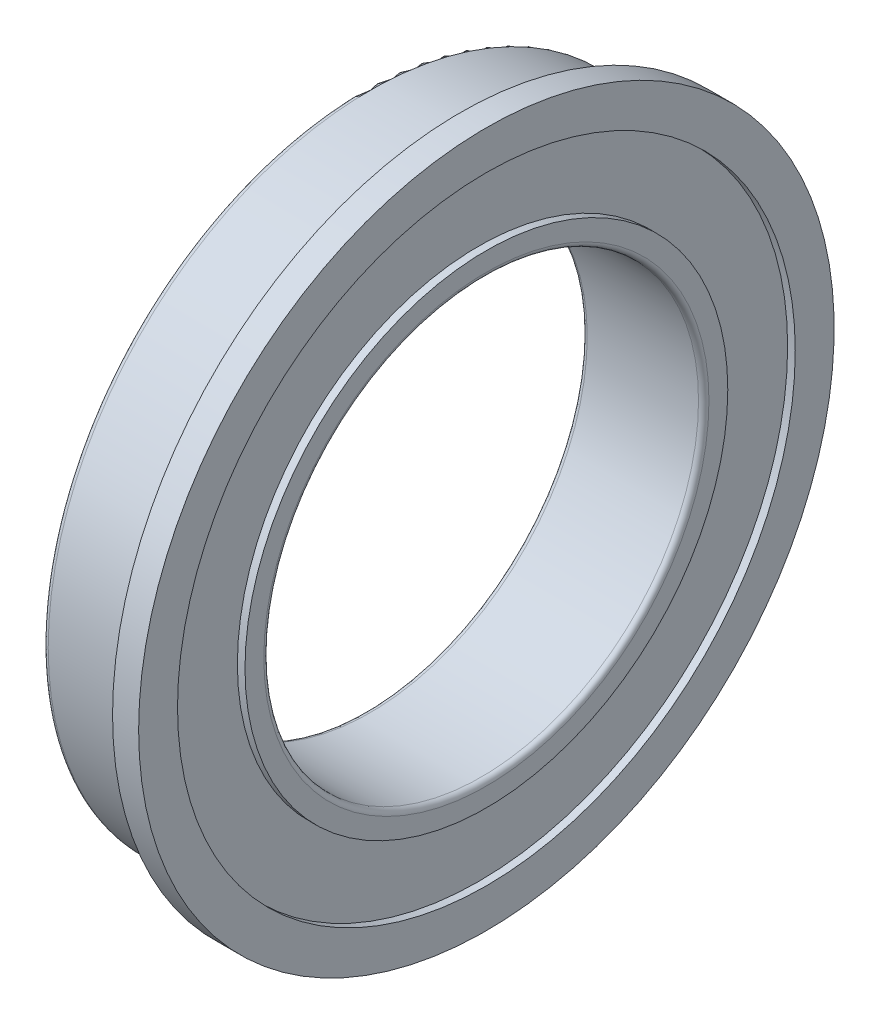
ISO-10303-21;
HEADER;
FILE_DESCRIPTION(('STEP AP214'),'2;1');
FILE_NAME('part.step','',(''),(''),'','','');
FILE_SCHEMA(('AUTOMOTIVE_DESIGN { 1 0 10303 214 1 1 1 1 }'));
ENDSEC;
DATA;
#1=APPLICATION_CONTEXT('core data for automotive mechanical design processes');
#2=APPLICATION_PROTOCOL_DEFINITION('international standard','automotive_design',2000,#1);
#3=PRODUCT_CONTEXT('',#1,'mechanical');
#4=PRODUCT('Part','Part','',(#3));
#5=PRODUCT_RELATED_PRODUCT_CATEGORY('part','',(#4));
#6=PRODUCT_DEFINITION_FORMATION('','',#4);
#7=PRODUCT_DEFINITION_CONTEXT('part definition',#1,'design');
#8=PRODUCT_DEFINITION('design','',#6,#7);
#9=PRODUCT_DEFINITION_SHAPE('','',#8);
#10=(LENGTH_UNIT() NAMED_UNIT(*) SI_UNIT(.MILLI.,.METRE.));
#11=(NAMED_UNIT(*) PLANE_ANGLE_UNIT() SI_UNIT($,.RADIAN.));
#12=(NAMED_UNIT(*) SI_UNIT($,.STERADIAN.) SOLID_ANGLE_UNIT());
#13=UNCERTAINTY_MEASURE_WITH_UNIT(LENGTH_MEASURE(1.E-05),#10,'distance_accuracy_value','');
#14=(GEOMETRIC_REPRESENTATION_CONTEXT(3) GLOBAL_UNCERTAINTY_ASSIGNED_CONTEXT((#13)) GLOBAL_UNIT_ASSIGNED_CONTEXT((#10,
#11,#12)) REPRESENTATION_CONTEXT('',''));
#15=CARTESIAN_POINT('',(0.,0.,0.));
#16=DIRECTION('',(0.,0.,1.));
#17=DIRECTION('',(1.,0.,0.));
#18=AXIS2_PLACEMENT_3D('',#15,#16,#17);
#19=CARTESIAN_POINT('',(0.,0.,0.));
#20=DIRECTION('',(-1.,0.,0.));
#21=DIRECTION('',(0.,0.,1.));
#22=AXIS2_PLACEMENT_3D('',#19,#20,#21);
#23=CYLINDRICAL_SURFACE('',#22,13.883);
#24=CARTESIAN_POINT('',(-0.638,0.,0.));
#25=DIRECTION('',(-1.,0.,0.));
#26=DIRECTION('',(0.,0.,1.));
#27=AXIS2_PLACEMENT_3D('',#24,#25,#26);
#28=CIRCLE('',#27,13.883);
#29=CARTESIAN_POINT('',(-0.638,0.,13.883));
#30=VERTEX_POINT('',#29);
#31=EDGE_CURVE('E61',#30,#30,#28,.T.);
#32=ORIENTED_EDGE('',*,*,#31,.T.);
#33=EDGE_LOOP('',(#32));
#34=FACE_BOUND('',#33,.T.);
#35=CARTESIAN_POINT('',(-0.438,0.,0.));
#36=DIRECTION('',(-1.,0.,0.));
#37=DIRECTION('',(0.,0.,1.));
#38=AXIS2_PLACEMENT_3D('',#35,#36,#37);
#39=CIRCLE('',#38,13.883);
#40=CARTESIAN_POINT('',(-0.438,0.,13.883));
#41=VERTEX_POINT('',#40);
#42=EDGE_CURVE('E11',#41,#41,#39,.T.);
#43=ORIENTED_EDGE('',*,*,#42,.F.);
#44=EDGE_LOOP('',(#43));
#45=FACE_BOUND('',#44,.T.);
#46=ADVANCED_FACE('F47',(#34,#45),#23,.F.);
#47=CARTESIAN_POINT('',(-0.438,0.,0.));
#48=DIRECTION('',(-1.,0.,0.));
#49=DIRECTION('',(0.,0.,1.));
#50=AXIS2_PLACEMENT_3D('',#47,#48,#49);
#51=PLANE('',#50);
#52=CARTESIAN_POINT('',(-0.438,0.,0.));
#53=DIRECTION('',(-1.,0.,0.));
#54=DIRECTION('',(0.,0.,1.));
#55=AXIS2_PLACEMENT_3D('',#52,#53,#54);
#56=CIRCLE('',#55,17.763);
#57=CARTESIAN_POINT('',(-0.438,0.,17.763));
#58=VERTEX_POINT('',#57);
#59=EDGE_CURVE('E53',#58,#58,#56,.T.);
#60=ORIENTED_EDGE('',*,*,#59,.F.);
#61=EDGE_LOOP('',(#60));
#62=FACE_BOUND('',#61,.T.);
#63=ORIENTED_EDGE('',*,*,#42,.T.);
#64=EDGE_LOOP('',(#63));
#65=FACE_BOUND('',#64,.T.);
#66=ADVANCED_FACE('F77',(#62,#65),#51,.F.);
#67=CARTESIAN_POINT('',(0.,0.,0.));
#68=DIRECTION('',(-1.,0.,0.));
#69=DIRECTION('',(0.,0.,1.));
#70=AXIS2_PLACEMENT_3D('',#67,#68,#69);
#71=CYLINDRICAL_SURFACE('',#70,17.763);
#72=ORIENTED_EDGE('',*,*,#59,.T.);
#73=EDGE_LOOP('',(#72));
#74=FACE_BOUND('',#73,.T.);
#75=CARTESIAN_POINT('',(-0.638,0.,0.));
#76=DIRECTION('',(-1.,0.,0.));
#77=DIRECTION('',(0.,0.,1.));
#78=AXIS2_PLACEMENT_3D('',#75,#76,#77);
#79=CIRCLE('',#78,17.763);
#80=CARTESIAN_POINT('',(-0.638,0.,17.763));
#81=VERTEX_POINT('',#80);
#82=EDGE_CURVE('E57',#81,#81,#79,.T.);
#83=ORIENTED_EDGE('',*,*,#82,.F.);
#84=EDGE_LOOP('',(#83));
#85=FACE_BOUND('',#84,.T.);
#86=ADVANCED_FACE('F71',(#74,#85),#71,.T.);
#87=CARTESIAN_POINT('',(-0.638,0.,0.));
#88=DIRECTION('',(-1.,0.,0.));
#89=DIRECTION('',(0.,0.,1.));
#90=AXIS2_PLACEMENT_3D('',#87,#88,#89);
#91=PLANE('',#90);
#92=ORIENTED_EDGE('',*,*,#82,.T.);
#93=EDGE_LOOP('',(#92));
#94=FACE_BOUND('',#93,.T.);
#95=ORIENTED_EDGE('',*,*,#31,.F.);
#96=EDGE_LOOP('',(#95));
#97=FACE_BOUND('',#96,.T.);
#98=ADVANCED_FACE('F69',(#94,#97),#91,.T.);
#99=CLOSED_SHELL('',(#46,#66,#86,#98));
#100=MANIFOLD_SOLID_BREP('B2',#99);
#101=CARTESIAN_POINT('',(-6.562,0.,0.));
#102=DIRECTION('',(-1.,0.,0.));
#103=DIRECTION('',(0.,0.,1.));
#104=AXIS2_PLACEMENT_3D('',#101,#102,#103);
#105=PLANE('',#104);
#106=CARTESIAN_POINT('',(-6.562,0.,0.));
#107=DIRECTION('',(-1.,0.,0.));
#108=DIRECTION('',(0.,0.,1.));
#109=AXIS2_PLACEMENT_3D('',#106,#107,#108);
#110=CIRCLE('',#109,17.763);
#111=CARTESIAN_POINT('',(-6.562,0.,17.763));
#112=VERTEX_POINT('',#111);
#113=EDGE_CURVE('E140',#112,#112,#110,.T.);
#114=ORIENTED_EDGE('',*,*,#113,.T.);
#115=EDGE_LOOP('',(#114));
#116=FACE_BOUND('',#115,.T.);
#117=CARTESIAN_POINT('',(-6.562,0.,0.));
#118=DIRECTION('',(-1.,0.,0.));
#119=DIRECTION('',(0.,0.,1.));
#120=AXIS2_PLACEMENT_3D('',#117,#118,#119);
#121=CIRCLE('',#120,13.883);
#122=CARTESIAN_POINT('',(-6.562,0.,13.883));
#123=VERTEX_POINT('',#122);
#124=EDGE_CURVE('E46',#123,#123,#121,.T.);
#125=ORIENTED_EDGE('',*,*,#124,.F.);
#126=EDGE_LOOP('',(#125));
#127=FACE_BOUND('',#126,.T.);
#128=ADVANCED_FACE('F126',(#116,#127),#105,.T.);
#129=CARTESIAN_POINT('',(0.,0.,0.));
#130=DIRECTION('',(-1.,0.,0.));
#131=DIRECTION('',(0.,0.,1.));
#132=AXIS2_PLACEMENT_3D('',#129,#130,#131);
#133=CYLINDRICAL_SURFACE('',#132,13.883);
#134=ORIENTED_EDGE('',*,*,#124,.T.);
#135=EDGE_LOOP('',(#134));
#136=FACE_BOUND('',#135,.T.);
#137=CARTESIAN_POINT('',(-6.362,0.,0.));
#138=DIRECTION('',(-1.,0.,0.));
#139=DIRECTION('',(0.,0.,1.));
#140=AXIS2_PLACEMENT_3D('',#137,#138,#139);
#141=CIRCLE('',#140,13.883);
#142=CARTESIAN_POINT('',(-6.362,0.,13.883));
#143=VERTEX_POINT('',#142);
#144=EDGE_CURVE('E132',#143,#143,#141,.T.);
#145=ORIENTED_EDGE('',*,*,#144,.F.);
#146=EDGE_LOOP('',(#145));
#147=FACE_BOUND('',#146,.T.);
#148=ADVANCED_FACE('F156',(#136,#147),#133,.F.);
#149=CARTESIAN_POINT('',(-6.362,0.,0.));
#150=DIRECTION('',(1.,0.,0.));
#151=DIRECTION('',(0.,0.,-1.));
#152=AXIS2_PLACEMENT_3D('',#149,#150,#151);
#153=PLANE('',#152);
#154=ORIENTED_EDGE('',*,*,#144,.T.);
#155=EDGE_LOOP('',(#154));
#156=FACE_BOUND('',#155,.T.);
#157=CARTESIAN_POINT('',(-6.362,0.,0.));
#158=DIRECTION('',(-1.,0.,0.));
#159=DIRECTION('',(0.,0.,1.));
#160=AXIS2_PLACEMENT_3D('',#157,#158,#159);
#161=CIRCLE('',#160,17.763);
#162=CARTESIAN_POINT('',(-6.362,0.,17.763));
#163=VERTEX_POINT('',#162);
#164=EDGE_CURVE('E136',#163,#163,#161,.T.);
#165=ORIENTED_EDGE('',*,*,#164,.F.);
#166=EDGE_LOOP('',(#165));
#167=FACE_BOUND('',#166,.T.);
#168=ADVANCED_FACE('F150',(#156,#167),#153,.T.);
#169=CARTESIAN_POINT('',(0.,0.,0.));
#170=DIRECTION('',(-1.,0.,0.));
#171=DIRECTION('',(0.,0.,1.));
#172=AXIS2_PLACEMENT_3D('',#169,#170,#171);
#173=CYLINDRICAL_SURFACE('',#172,17.763);
#174=ORIENTED_EDGE('',*,*,#164,.T.);
#175=EDGE_LOOP('',(#174));
#176=FACE_BOUND('',#175,.T.);
#177=ORIENTED_EDGE('',*,*,#113,.F.);
#178=EDGE_LOOP('',(#177));
#179=FACE_BOUND('',#178,.T.);
#180=ADVANCED_FACE('F148',(#176,#179),#173,.T.);
#181=CLOSED_SHELL('',(#128,#148,#168,#180));
#182=MANIFOLD_SOLID_BREP('B6',#181);
#183=CARTESIAN_POINT('',(-3.5,14.8687563386955,5.41178472784187));
#184=DIRECTION('',(-1.,0.,0.));
#185=DIRECTION('',(0.,0.939692620785913,0.342020143325657));
#186=AXIS2_PLACEMENT_3D('',#183,#184,#185);
#187=SPHERICAL_SURFACE('',#186,1.5);
#188=CARTESIAN_POINT('',(-5.,14.8687563386955,5.41178472784187));
#189=VERTEX_POINT('',#188);
#190=VERTEX_LOOP('',#189);
#191=FACE_BOUND('',#190,.T.);
#192=ADVANCED_FACE('F205',(#191),#187,.T.);
#193=CLOSED_SHELL('',(#192));
#194=MANIFOLD_SOLID_BREP('B41',#193);
#195=CARTESIAN_POINT('',(-3.5,12.1211212234717,10.17082834807));
#196=DIRECTION('',(-1.,0.,0.));
#197=DIRECTION('',(0.,0.766044443118986,0.64278760968653));
#198=AXIS2_PLACEMENT_3D('',#195,#196,#197);
#199=SPHERICAL_SURFACE('',#198,1.5);
#200=CARTESIAN_POINT('',(-5.,12.1211212234717,10.17082834807));
#201=VERTEX_POINT('',#200);
#202=VERTEX_LOOP('',#201);
#203=FACE_BOUND('',#202,.T.);
#204=ADVANCED_FACE('F226',(#203),#199,.T.);
#205=CLOSED_SHELL('',(#204));
#206=MANIFOLD_SOLID_BREP('B122',#205);
#207=CARTESIAN_POINT('',(-3.5,7.91150000000016,13.7031199640811));
#208=DIRECTION('',(-1.,0.,0.));
#209=DIRECTION('',(0.,0.50000000000001,0.866025403784433));
#210=AXIS2_PLACEMENT_3D('',#207,#208,#209);
#211=SPHERICAL_SURFACE('',#210,1.5);
#212=CARTESIAN_POINT('',(-5.,7.91150000000016,13.7031199640811));
#213=VERTEX_POINT('',#212);
#214=VERTEX_LOOP('',#213);
#215=FACE_BOUND('',#214,.T.);
#216=ADVANCED_FACE('F247',(#215),#211,.T.);
#217=CLOSED_SHELL('',(#216));
#218=MANIFOLD_SOLID_BREP('B201',#217);
#219=CARTESIAN_POINT('',(-3.5,2.747635115224,15.5826130759121));
#220=DIRECTION('',(-1.,0.,0.));
#221=DIRECTION('',(0.,0.17364817766694,0.984807753012206));
#222=AXIS2_PLACEMENT_3D('',#219,#220,#221);
#223=SPHERICAL_SURFACE('',#222,1.5);
#224=CARTESIAN_POINT('',(-5.,2.747635115224,15.5826130759121));
#225=VERTEX_POINT('',#224);
#226=VERTEX_LOOP('',#225);
#227=FACE_BOUND('',#226,.T.);
#228=ADVANCED_FACE('F268',(#227),#223,.T.);
#229=CLOSED_SHELL('',(#228));
#230=MANIFOLD_SOLID_BREP('B222',#229);
#231=CARTESIAN_POINT('',(-3.5,-2.74763511522369,15.5826130759122));
#232=DIRECTION('',(-1.,0.,0.));
#233=DIRECTION('',(0.,-0.173648177666921,0.98480775301221));
#234=AXIS2_PLACEMENT_3D('',#231,#232,#233);
#235=SPHERICAL_SURFACE('',#234,1.5);
#236=CARTESIAN_POINT('',(-5.,-2.74763511522369,15.5826130759122));
#237=VERTEX_POINT('',#236);
#238=VERTEX_LOOP('',#237);
#239=FACE_BOUND('',#238,.T.);
#240=ADVANCED_FACE('F289',(#239),#235,.T.);
#241=CLOSED_SHELL('',(#240));
#242=MANIFOLD_SOLID_BREP('B243',#241);
#243=CARTESIAN_POINT('',(-3.5,-7.91149999999987,13.7031199640812));
#244=DIRECTION('',(-1.,0.,0.));
#245=DIRECTION('',(0.,-0.499999999999992,0.866025403784443));
#246=AXIS2_PLACEMENT_3D('',#243,#244,#245);
#247=SPHERICAL_SURFACE('',#246,1.5);
#248=CARTESIAN_POINT('',(-5.,-7.91149999999987,13.7031199640812));
#249=VERTEX_POINT('',#248);
#250=VERTEX_LOOP('',#249);
#251=FACE_BOUND('',#250,.T.);
#252=ADVANCED_FACE('F310',(#251),#247,.T.);
#253=CLOSED_SHELL('',(#252));
#254=MANIFOLD_SOLID_BREP('B264',#253);
#255=CARTESIAN_POINT('',(-3.5,-12.1211212234715,10.1708283480702));
#256=DIRECTION('',(-1.,0.,0.));
#257=DIRECTION('',(0.,-0.766044443118973,0.642787609686546));
#258=AXIS2_PLACEMENT_3D('',#255,#256,#257);
#259=SPHERICAL_SURFACE('',#258,1.5);
#260=CARTESIAN_POINT('',(-5.,-12.1211212234715,10.1708283480702));
#261=VERTEX_POINT('',#260);
#262=VERTEX_LOOP('',#261);
#263=FACE_BOUND('',#262,.T.);
#264=ADVANCED_FACE('F331',(#263),#259,.T.);
#265=CLOSED_SHELL('',(#264));
#266=MANIFOLD_SOLID_BREP('B285',#265);
#267=CARTESIAN_POINT('',(-3.5,-14.8687563386954,5.41178472784217));
#268=DIRECTION('',(-1.,0.,0.));
#269=DIRECTION('',(0.,-0.939692620785906,0.342020143325676));
#270=AXIS2_PLACEMENT_3D('',#267,#268,#269);
#271=SPHERICAL_SURFACE('',#270,1.5);
#272=CARTESIAN_POINT('',(-5.,-14.8687563386954,5.41178472784217));
#273=VERTEX_POINT('',#272);
#274=VERTEX_LOOP('',#273);
#275=FACE_BOUND('',#274,.T.);
#276=ADVANCED_FACE('F352',(#275),#271,.T.);
#277=CLOSED_SHELL('',(#276));
#278=MANIFOLD_SOLID_BREP('B306',#277);
#279=CARTESIAN_POINT('',(-3.5,-15.823,0.));
#280=DIRECTION('',(-1.,0.,0.));
#281=DIRECTION('',(0.,-1.,0.));
#282=AXIS2_PLACEMENT_3D('',#279,#280,#281);
#283=SPHERICAL_SURFACE('',#282,1.5);
#284=CARTESIAN_POINT('',(-5.,-15.823,0.));
#285=VERTEX_POINT('',#284);
#286=VERTEX_LOOP('',#285);
#287=FACE_BOUND('',#286,.T.);
#288=ADVANCED_FACE('F373',(#287),#283,.T.);
#289=CLOSED_SHELL('',(#288));
#290=MANIFOLD_SOLID_BREP('B327',#289);
#291=CARTESIAN_POINT('',(-3.5,-14.8687563386955,-5.41178472784197));
#292=DIRECTION('',(-1.,0.,0.));
#293=DIRECTION('',(0.,-0.939692620785911,-0.342020143325663));
#294=AXIS2_PLACEMENT_3D('',#291,#292,#293);
#295=SPHERICAL_SURFACE('',#294,1.5);
#296=CARTESIAN_POINT('',(-5.,-14.8687563386955,-5.41178472784197));
#297=VERTEX_POINT('',#296);
#298=VERTEX_LOOP('',#297);
#299=FACE_BOUND('',#298,.T.);
#300=ADVANCED_FACE('F394',(#299),#295,.T.);
#301=CLOSED_SHELL('',(#300));
#302=MANIFOLD_SOLID_BREP('B348',#301);
#303=CARTESIAN_POINT('',(-3.5,-12.1211212234716,-10.17082834807));
#304=DIRECTION('',(-1.,0.,0.));
#305=DIRECTION('',(0.,-0.766044443118981,-0.642787609686535));
#306=AXIS2_PLACEMENT_3D('',#303,#304,#305);
#307=SPHERICAL_SURFACE('',#306,1.5);
#308=CARTESIAN_POINT('',(-5.,-12.1211212234716,-10.17082834807));
#309=VERTEX_POINT('',#308);
#310=VERTEX_LOOP('',#309);
#311=FACE_BOUND('',#310,.T.);
#312=ADVANCED_FACE('F415',(#311),#307,.T.);
#313=CLOSED_SHELL('',(#312));
#314=MANIFOLD_SOLID_BREP('B369',#313);
#315=CARTESIAN_POINT('',(-3.5,-7.91150000000006,-13.7031199640811));
#316=DIRECTION('',(-1.,0.,0.));
#317=DIRECTION('',(0.,-0.500000000000004,-0.866025403784436));
#318=AXIS2_PLACEMENT_3D('',#315,#316,#317);
#319=SPHERICAL_SURFACE('',#318,1.5);
#320=CARTESIAN_POINT('',(-5.,-7.91150000000006,-13.7031199640811));
#321=VERTEX_POINT('',#320);
#322=VERTEX_LOOP('',#321);
#323=FACE_BOUND('',#322,.T.);
#324=ADVANCED_FACE('F436',(#323),#319,.T.);
#325=CLOSED_SHELL('',(#324));
#326=MANIFOLD_SOLID_BREP('B390',#325);
#327=CARTESIAN_POINT('',(-3.5,-2.7476351152239,-15.5826130759122));
#328=DIRECTION('',(-1.,0.,0.));
#329=DIRECTION('',(0.,-0.173648177666934,-0.984807753012207));
#330=AXIS2_PLACEMENT_3D('',#327,#328,#329);
#331=SPHERICAL_SURFACE('',#330,1.5);
#332=CARTESIAN_POINT('',(-5.,-2.7476351152239,-15.5826130759122));
#333=VERTEX_POINT('',#332);
#334=VERTEX_LOOP('',#333);
#335=FACE_BOUND('',#334,.T.);
#336=ADVANCED_FACE('F457',(#335),#331,.T.);
#337=CLOSED_SHELL('',(#336));
#338=MANIFOLD_SOLID_BREP('B411',#337);
#339=CARTESIAN_POINT('',(-3.5,2.74763511522379,-15.5826130759122));
#340=DIRECTION('',(-1.,0.,0.));
#341=DIRECTION('',(0.,0.173648177666927,-0.984807753012209));
#342=AXIS2_PLACEMENT_3D('',#339,#340,#341);
#343=SPHERICAL_SURFACE('',#342,1.5);
#344=CARTESIAN_POINT('',(-5.,2.74763511522379,-15.5826130759122));
#345=VERTEX_POINT('',#344);
#346=VERTEX_LOOP('',#345);
#347=FACE_BOUND('',#346,.T.);
#348=ADVANCED_FACE('F478',(#347),#343,.T.);
#349=CLOSED_SHELL('',(#348));
#350=MANIFOLD_SOLID_BREP('B432',#349);
#351=CARTESIAN_POINT('',(-3.5,7.91149999999997,-13.7031199640812));
#352=DIRECTION('',(-1.,0.,0.));
#353=DIRECTION('',(0.,0.499999999999998,-0.86602540378444));
#354=AXIS2_PLACEMENT_3D('',#351,#352,#353);
#355=SPHERICAL_SURFACE('',#354,1.5);
#356=CARTESIAN_POINT('',(-5.,7.91149999999997,-13.7031199640812));
#357=VERTEX_POINT('',#356);
#358=VERTEX_LOOP('',#357);
#359=FACE_BOUND('',#358,.T.);
#360=ADVANCED_FACE('F499',(#359),#355,.T.);
#361=CLOSED_SHELL('',(#360));
#362=MANIFOLD_SOLID_BREP('B453',#361);
#363=CARTESIAN_POINT('',(-3.5,12.1211212234716,-10.1708283480701));
#364=DIRECTION('',(-1.,0.,0.));
#365=DIRECTION('',(0.,0.766044443118977,-0.642787609686541));
#366=AXIS2_PLACEMENT_3D('',#363,#364,#365);
#367=SPHERICAL_SURFACE('',#366,1.5);
#368=CARTESIAN_POINT('',(-5.,12.1211212234716,-10.1708283480701));
#369=VERTEX_POINT('',#368);
#370=VERTEX_LOOP('',#369);
#371=FACE_BOUND('',#370,.T.);
#372=ADVANCED_FACE('F520',(#371),#367,.T.);
#373=CLOSED_SHELL('',(#372));
#374=MANIFOLD_SOLID_BREP('B474',#373);
#375=CARTESIAN_POINT('',(-3.5,14.8687563386954,-5.41178472784207));
#376=DIRECTION('',(-1.,0.,0.));
#377=DIRECTION('',(0.,0.939692620785908,-0.342020143325669));
#378=AXIS2_PLACEMENT_3D('',#375,#376,#377);
#379=SPHERICAL_SURFACE('',#378,1.5);
#380=CARTESIAN_POINT('',(-5.,14.8687563386954,-5.41178472784207));
#381=VERTEX_POINT('',#380);
#382=VERTEX_LOOP('',#381);
#383=FACE_BOUND('',#382,.T.);
#384=ADVANCED_FACE('F541',(#383),#379,.T.);
#385=CLOSED_SHELL('',(#384));
#386=MANIFOLD_SOLID_BREP('B495',#385);
#387=CARTESIAN_POINT('',(-3.5,15.823,0.));
#388=DIRECTION('',(-1.,0.,0.));
#389=DIRECTION('',(0.,1.,0.));
#390=AXIS2_PLACEMENT_3D('',#387,#388,#389);
#391=SPHERICAL_SURFACE('',#390,1.5);
#392=CARTESIAN_POINT('',(-5.,15.823,0.));
#393=VERTEX_POINT('',#392);
#394=VERTEX_LOOP('',#393);
#395=FACE_BOUND('',#394,.T.);
#396=ADVANCED_FACE('F564',(#395),#391,.T.);
#397=CLOSED_SHELL('',(#396));
#398=MANIFOLD_SOLID_BREP('B516',#397);
#399=CARTESIAN_POINT('',(0.,0.,0.));
#400=DIRECTION('',(-1.,0.,0.));
#401=DIRECTION('',(0.,0.,1.));
#402=AXIS2_PLACEMENT_3D('',#399,#400,#401);
#403=CYLINDRICAL_SURFACE('',#402,16.923);
#404=CARTESIAN_POINT('',(-4.51980390271856,0.,0.));
#405=DIRECTION('',(-1.,0.,0.));
#406=DIRECTION('',(0.,0.,1.));
#407=AXIS2_PLACEMENT_3D('',#404,#405,#406);
#408=CIRCLE('',#407,16.923);
#409=CARTESIAN_POINT('',(-4.51980390271856,0.,16.923));
#410=VERTEX_POINT('',#409);
#411=EDGE_CURVE('E597',#410,#410,#408,.T.);
#412=ORIENTED_EDGE('',*,*,#411,.F.);
#413=EDGE_LOOP('',(#412));
#414=FACE_BOUND('',#413,.T.);
#415=CARTESIAN_POINT('',(-6.362,0.,0.));
#416=DIRECTION('',(-1.,0.,0.));
#417=DIRECTION('',(0.,0.,1.));
#418=AXIS2_PLACEMENT_3D('',#415,#416,#417);
#419=CIRCLE('',#418,16.923);
#420=CARTESIAN_POINT('',(-6.362,0.,16.923));
#421=VERTEX_POINT('',#420);
#422=EDGE_CURVE('E633',#421,#421,#419,.T.);
#423=ORIENTED_EDGE('',*,*,#422,.T.);
#424=EDGE_LOOP('',(#423));
#425=FACE_BOUND('',#424,.T.);
#426=ADVANCED_FACE('F586',(#414,#425),#403,.F.);
#427=CARTESIAN_POINT('',(-3.5,0.,0.));
#428=DIRECTION('',(-1.,0.,0.));
#429=DIRECTION('',(0.,0.,1.));
#430=AXIS2_PLACEMENT_3D('',#427,#428,#429);
#431=TOROIDAL_SURFACE('',#430,15.823,1.5);
#432=CARTESIAN_POINT('',(-2.48019609728144,0.,0.));
#433=DIRECTION('',(-1.,0.,0.));
#434=DIRECTION('',(0.,0.,1.));
#435=AXIS2_PLACEMENT_3D('',#432,#433,#434);
#436=CIRCLE('',#435,16.923);
#437=CARTESIAN_POINT('',(-2.48019609728144,0.,16.923));
#438=VERTEX_POINT('',#437);
#439=EDGE_CURVE('E601',#438,#438,#436,.T.);
#440=ORIENTED_EDGE('',*,*,#439,.F.);
#441=EDGE_LOOP('',(#440));
#442=FACE_BOUND('',#441,.T.);
#443=ORIENTED_EDGE('',*,*,#411,.T.);
#444=EDGE_LOOP('',(#443));
#445=FACE_BOUND('',#444,.T.);
#446=ADVANCED_FACE('F660',(#442,#445),#431,.F.);
#447=CARTESIAN_POINT('',(0.,0.,0.));
#448=DIRECTION('',(-1.,0.,0.));
#449=DIRECTION('',(0.,0.,1.));
#450=AXIS2_PLACEMENT_3D('',#447,#448,#449);
#451=CYLINDRICAL_SURFACE('',#450,16.923);
#452=CARTESIAN_POINT('',(-0.638,0.,0.));
#453=DIRECTION('',(-1.,0.,0.));
#454=DIRECTION('',(0.,0.,1.));
#455=AXIS2_PLACEMENT_3D('',#452,#453,#454);
#456=CIRCLE('',#455,16.923);
#457=CARTESIAN_POINT('',(-0.638,0.,16.923));
#458=VERTEX_POINT('',#457);
#459=EDGE_CURVE('E606',#458,#458,#456,.T.);
#460=ORIENTED_EDGE('',*,*,#459,.F.);
#461=EDGE_LOOP('',(#460));
#462=FACE_BOUND('',#461,.T.);
#463=ORIENTED_EDGE('',*,*,#439,.T.);
#464=EDGE_LOOP('',(#463));
#465=FACE_BOUND('',#464,.T.);
#466=ADVANCED_FACE('F665',(#462,#465),#451,.F.);
#467=CARTESIAN_POINT('',(-0.638,0.,0.));
#468=DIRECTION('',(-1.,0.,0.));
#469=DIRECTION('',(0.,0.,1.));
#470=AXIS2_PLACEMENT_3D('',#467,#468,#469);
#471=PLANE('',#470);
#472=CARTESIAN_POINT('',(-0.638,0.,0.));
#473=DIRECTION('',(-1.,0.,0.));
#474=DIRECTION('',(0.,0.,1.));
#475=AXIS2_PLACEMENT_3D('',#472,#473,#474);
#476=CIRCLE('',#475,17.763);
#477=CARTESIAN_POINT('',(-0.638,0.,17.763));
#478=VERTEX_POINT('',#477);
#479=EDGE_CURVE('E609',#478,#478,#476,.T.);
#480=ORIENTED_EDGE('',*,*,#479,.F.);
#481=EDGE_LOOP('',(#480));
#482=FACE_BOUND('',#481,.T.);
#483=ORIENTED_EDGE('',*,*,#459,.T.);
#484=EDGE_LOOP('',(#483));
#485=FACE_BOUND('',#484,.T.);
#486=ADVANCED_FACE('F672',(#482,#485),#471,.F.);
#487=CARTESIAN_POINT('',(0.,0.,0.));
#488=DIRECTION('',(-1.,0.,0.));
#489=DIRECTION('',(0.,0.,1.));
#490=AXIS2_PLACEMENT_3D('',#487,#488,#489);
#491=CYLINDRICAL_SURFACE('',#490,17.763);
#492=CARTESIAN_POINT('',(0.,0.,0.));
#493=DIRECTION('',(-1.,0.,0.));
#494=DIRECTION('',(0.,0.,1.));
#495=AXIS2_PLACEMENT_3D('',#492,#493,#494);
#496=CIRCLE('',#495,17.763);
#497=CARTESIAN_POINT('',(0.,0.,17.763));
#498=VERTEX_POINT('',#497);
#499=EDGE_CURVE('E612',#498,#498,#496,.T.);
#500=ORIENTED_EDGE('',*,*,#499,.F.);
#501=EDGE_LOOP('',(#500));
#502=FACE_BOUND('',#501,.T.);
#503=ORIENTED_EDGE('',*,*,#479,.T.);
#504=EDGE_LOOP('',(#503));
#505=FACE_BOUND('',#504,.T.);
#506=ADVANCED_FACE('F676',(#502,#505),#491,.F.);
#507=CARTESIAN_POINT('',(0.,0.,0.));
#508=DIRECTION('',(-1.,0.,0.));
#509=DIRECTION('',(0.,0.,1.));
#510=AXIS2_PLACEMENT_3D('',#507,#508,#509);
#511=PLANE('',#510);
#512=CARTESIAN_POINT('',(0.,0.,0.));
#513=DIRECTION('',(-1.,0.,0.));
#514=DIRECTION('',(0.,0.,1.));
#515=AXIS2_PLACEMENT_3D('',#512,#513,#514);
#516=CIRCLE('',#515,20.);
#517=CARTESIAN_POINT('',(0.,0.,20.));
#518=VERTEX_POINT('',#517);
#519=EDGE_CURVE('E615',#518,#518,#516,.T.);
#520=ORIENTED_EDGE('',*,*,#519,.F.);
#521=EDGE_LOOP('',(#520));
#522=FACE_BOUND('',#521,.T.);
#523=ORIENTED_EDGE('',*,*,#499,.T.);
#524=EDGE_LOOP('',(#523));
#525=FACE_BOUND('',#524,.T.);
#526=ADVANCED_FACE('F680',(#522,#525),#511,.F.);
#527=CARTESIAN_POINT('',(0.,0.,0.));
#528=DIRECTION('',(-1.,0.,0.));
#529=DIRECTION('',(0.,0.,1.));
#530=AXIS2_PLACEMENT_3D('',#527,#528,#529);
#531=CYLINDRICAL_SURFACE('',#530,20.);
#532=CARTESIAN_POINT('',(-1.5,0.,0.));
#533=DIRECTION('',(-1.,0.,0.));
#534=DIRECTION('',(0.,0.,1.));
#535=AXIS2_PLACEMENT_3D('',#532,#533,#534);
#536=CIRCLE('',#535,20.);
#537=CARTESIAN_POINT('',(-1.5,0.,20.));
#538=VERTEX_POINT('',#537);
#539=EDGE_CURVE('E618',#538,#538,#536,.T.);
#540=ORIENTED_EDGE('',*,*,#539,.F.);
#541=EDGE_LOOP('',(#540));
#542=FACE_BOUND('',#541,.T.);
#543=ORIENTED_EDGE('',*,*,#519,.T.);
#544=EDGE_LOOP('',(#543));
#545=FACE_BOUND('',#544,.T.);
#546=ADVANCED_FACE('F684',(#542,#545),#531,.T.);
#547=CARTESIAN_POINT('',(-1.5,0.,0.));
#548=DIRECTION('',(1.,0.,0.));
#549=DIRECTION('',(0.,0.,-1.));
#550=AXIS2_PLACEMENT_3D('',#547,#548,#549);
#551=PLANE('',#550);
#552=CARTESIAN_POINT('',(-1.5,0.,0.));
#553=DIRECTION('',(-1.,0.,0.));
#554=DIRECTION('',(0.,0.,1.));
#555=AXIS2_PLACEMENT_3D('',#552,#553,#554);
#556=CIRCLE('',#555,18.7);
#557=CARTESIAN_POINT('',(-1.5,0.,18.7));
#558=VERTEX_POINT('',#557);
#559=EDGE_CURVE('E621',#558,#558,#556,.T.);
#560=ORIENTED_EDGE('',*,*,#559,.F.);
#561=EDGE_LOOP('',(#560));
#562=FACE_BOUND('',#561,.T.);
#563=ORIENTED_EDGE('',*,*,#539,.T.);
#564=EDGE_LOOP('',(#563));
#565=FACE_BOUND('',#564,.T.);
#566=ADVANCED_FACE('F688',(#562,#565),#551,.F.);
#567=CARTESIAN_POINT('',(-1.5,0.,0.));
#568=DIRECTION('',(-1.,0.,0.));
#569=DIRECTION('',(0.,0.,1.));
#570=AXIS2_PLACEMENT_3D('',#567,#568,#569);
#571=TOROIDAL_SURFACE('',#570,18.5,0.199999999999999);
#572=ORIENTED_EDGE('',*,*,#559,.T.);
#573=EDGE_LOOP('',(#572));
#574=FACE_BOUND('',#573,.T.);
#575=CARTESIAN_POINT('',(-1.7,0.,0.));
#576=DIRECTION('',(-1.,0.,0.));
#577=DIRECTION('',(0.,0.,1.));
#578=AXIS2_PLACEMENT_3D('',#575,#576,#577);
#579=CIRCLE('',#578,18.5);
#580=CARTESIAN_POINT('',(-1.7,0.,18.5));
#581=VERTEX_POINT('',#580);
#582=EDGE_CURVE('E624',#581,#581,#579,.T.);
#583=ORIENTED_EDGE('',*,*,#582,.F.);
#584=EDGE_LOOP('',(#583));
#585=FACE_BOUND('',#584,.T.);
#586=ADVANCED_FACE('F657',(#574,#585),#571,.F.);
#587=CARTESIAN_POINT('',(0.,0.,0.));
#588=DIRECTION('',(-1.,0.,0.));
#589=DIRECTION('',(0.,0.,1.));
#590=AXIS2_PLACEMENT_3D('',#587,#588,#589);
#591=CYLINDRICAL_SURFACE('',#590,18.5);
#592=CARTESIAN_POINT('',(-6.7,0.,0.));
#593=DIRECTION('',(1.,0.,0.));
#594=DIRECTION('',(0.,0.,-1.));
#595=AXIS2_PLACEMENT_3D('',#592,#593,#594);
#596=CIRCLE('',#595,18.5);
#597=CARTESIAN_POINT('',(-6.7,0.,-18.5));
#598=VERTEX_POINT('',#597);
#599=EDGE_CURVE('E563',#598,#598,#596,.T.);
#600=ORIENTED_EDGE('',*,*,#599,.T.);
#601=EDGE_LOOP('',(#600));
#602=FACE_BOUND('',#601,.T.);
#603=ORIENTED_EDGE('',*,*,#582,.T.);
#604=EDGE_LOOP('',(#603));
#605=FACE_BOUND('',#604,.T.);
#606=ADVANCED_FACE('F652',(#602,#605),#591,.T.);
#607=CARTESIAN_POINT('',(-7.,0.,0.));
#608=DIRECTION('',(1.,0.,0.));
#609=DIRECTION('',(0.,0.,-1.));
#610=AXIS2_PLACEMENT_3D('',#607,#608,#609);
#611=PLANE('',#610);
#612=CARTESIAN_POINT('',(-7.,0.,0.));
#613=DIRECTION('',(1.,0.,0.));
#614=DIRECTION('',(0.,0.,-1.));
#615=AXIS2_PLACEMENT_3D('',#612,#613,#614);
#616=CIRCLE('',#615,18.2);
#617=CARTESIAN_POINT('',(-7.,0.,-18.2));
#618=VERTEX_POINT('',#617);
#619=EDGE_CURVE('E593',#618,#618,#616,.F.);
#620=ORIENTED_EDGE('',*,*,#619,.T.);
#621=EDGE_LOOP('',(#620));
#622=FACE_BOUND('',#621,.T.);
#623=CARTESIAN_POINT('',(-7.,0.,0.));
#624=DIRECTION('',(-1.,0.,0.));
#625=DIRECTION('',(0.,0.,1.));
#626=AXIS2_PLACEMENT_3D('',#623,#624,#625);
#627=CIRCLE('',#626,17.763);
#628=CARTESIAN_POINT('',(-7.,0.,17.763));
#629=VERTEX_POINT('',#628);
#630=EDGE_CURVE('E627',#629,#629,#627,.T.);
#631=ORIENTED_EDGE('',*,*,#630,.F.);
#632=EDGE_LOOP('',(#631));
#633=FACE_BOUND('',#632,.T.);
#634=ADVANCED_FACE('F647',(#622,#633),#611,.F.);
#635=CARTESIAN_POINT('',(0.,0.,0.));
#636=DIRECTION('',(-1.,0.,0.));
#637=DIRECTION('',(0.,0.,1.));
#638=AXIS2_PLACEMENT_3D('',#635,#636,#637);
#639=CYLINDRICAL_SURFACE('',#638,17.763);
#640=CARTESIAN_POINT('',(-6.362,0.,0.));
#641=DIRECTION('',(-1.,0.,0.));
#642=DIRECTION('',(0.,0.,1.));
#643=AXIS2_PLACEMENT_3D('',#640,#641,#642);
#644=CIRCLE('',#643,17.763);
#645=CARTESIAN_POINT('',(-6.362,0.,17.763));
#646=VERTEX_POINT('',#645);
#647=EDGE_CURVE('E630',#646,#646,#644,.T.);
#648=ORIENTED_EDGE('',*,*,#647,.F.);
#649=EDGE_LOOP('',(#648));
#650=FACE_BOUND('',#649,.T.);
#651=ORIENTED_EDGE('',*,*,#630,.T.);
#652=EDGE_LOOP('',(#651));
#653=FACE_BOUND('',#652,.T.);
#654=ADVANCED_FACE('F641',(#650,#653),#639,.F.);
#655=CARTESIAN_POINT('',(-6.362,0.,0.));
#656=DIRECTION('',(1.,0.,0.));
#657=DIRECTION('',(0.,0.,-1.));
#658=AXIS2_PLACEMENT_3D('',#655,#656,#657);
#659=PLANE('',#658);
#660=ORIENTED_EDGE('',*,*,#422,.F.);
#661=EDGE_LOOP('',(#660));
#662=FACE_BOUND('',#661,.T.);
#663=ORIENTED_EDGE('',*,*,#647,.T.);
#664=EDGE_LOOP('',(#663));
#665=FACE_BOUND('',#664,.T.);
#666=ADVANCED_FACE('F638',(#662,#665),#659,.F.);
#667=CARTESIAN_POINT('',(-6.7,0.,0.));
#668=DIRECTION('',(1.,0.,0.));
#669=DIRECTION('',(0.,0.,-1.));
#670=AXIS2_PLACEMENT_3D('',#667,#668,#669);
#671=TOROIDAL_SURFACE('',#670,18.2,0.3);
#672=ORIENTED_EDGE('',*,*,#599,.F.);
#673=EDGE_LOOP('',(#672));
#674=FACE_BOUND('',#673,.T.);
#675=ORIENTED_EDGE('',*,*,#619,.F.);
#676=EDGE_LOOP('',(#675));
#677=FACE_BOUND('',#676,.T.);
#678=ADVANCED_FACE('F588',(#674,#677),#671,.T.);
#679=CLOSED_SHELL('',(#426,#446,#466,#486,#506,#526,#546,#566,#586,#606,#634,#654,#666,#678));
#680=MANIFOLD_SOLID_BREP('B537',#679);
#681=CARTESIAN_POINT('',(-3.5,0.,0.));
#682=DIRECTION('',(-1.,0.,0.));
#683=DIRECTION('',(0.,0.,1.));
#684=AXIS2_PLACEMENT_3D('',#681,#682,#683);
#685=TOROIDAL_SURFACE('',#684,15.823,1.5);
#686=CARTESIAN_POINT('',(-2.48019609728144,0.,0.));
#687=DIRECTION('',(-1.,0.,0.));
#688=DIRECTION('',(0.,0.,1.));
#689=AXIS2_PLACEMENT_3D('',#686,#687,#688);
#690=CIRCLE('',#689,14.723);
#691=CARTESIAN_POINT('',(-2.48019609728144,0.,14.723));
#692=VERTEX_POINT('',#691);
#693=EDGE_CURVE('E853',#692,#692,#690,.T.);
#694=ORIENTED_EDGE('',*,*,#693,.T.);
#695=EDGE_LOOP('',(#694));
#696=FACE_BOUND('',#695,.T.);
#697=CARTESIAN_POINT('',(-4.51980390271856,0.,0.));
#698=DIRECTION('',(-1.,0.,0.));
#699=DIRECTION('',(0.,0.,1.));
#700=AXIS2_PLACEMENT_3D('',#697,#698,#699);
#701=CIRCLE('',#700,14.723);
#702=CARTESIAN_POINT('',(-4.51980390271856,0.,14.723));
#703=VERTEX_POINT('',#702);
#704=EDGE_CURVE('E832',#703,#703,#701,.T.);
#705=ORIENTED_EDGE('',*,*,#704,.F.);
#706=EDGE_LOOP('',(#705));
#707=FACE_BOUND('',#706,.T.);
#708=ADVANCED_FACE('F812',(#696,#707),#685,.F.);
#709=CARTESIAN_POINT('',(0.,0.,0.));
#710=DIRECTION('',(-1.,0.,0.));
#711=DIRECTION('',(0.,0.,1.));
#712=AXIS2_PLACEMENT_3D('',#709,#710,#711);
#713=CYLINDRICAL_SURFACE('',#712,14.723);
#714=ORIENTED_EDGE('',*,*,#704,.T.);
#715=EDGE_LOOP('',(#714));
#716=FACE_BOUND('',#715,.T.);
#717=CARTESIAN_POINT('',(-6.362,0.,0.));
#718=DIRECTION('',(-1.,0.,0.));
#719=DIRECTION('',(0.,0.,1.));
#720=AXIS2_PLACEMENT_3D('',#717,#718,#719);
#721=CIRCLE('',#720,14.723);
#722=CARTESIAN_POINT('',(-6.362,0.,14.723));
#723=VERTEX_POINT('',#722);
#724=EDGE_CURVE('E835',#723,#723,#721,.T.);
#725=ORIENTED_EDGE('',*,*,#724,.F.);
#726=EDGE_LOOP('',(#725));
#727=FACE_BOUND('',#726,.T.);
#728=ADVANCED_FACE('F874',(#716,#727),#713,.T.);
#729=CARTESIAN_POINT('',(-6.362,0.,0.));
#730=DIRECTION('',(1.,0.,0.));
#731=DIRECTION('',(0.,0.,-1.));
#732=AXIS2_PLACEMENT_3D('',#729,#730,#731);
#733=PLANE('',#732);
#734=CARTESIAN_POINT('',(-6.362,0.,0.));
#735=DIRECTION('',(-1.,0.,0.));
#736=DIRECTION('',(0.,0.,1.));
#737=AXIS2_PLACEMENT_3D('',#734,#735,#736);
#738=CIRCLE('',#737,13.883);
#739=CARTESIAN_POINT('',(-6.362,0.,13.883));
#740=VERTEX_POINT('',#739);
#741=EDGE_CURVE('E838',#740,#740,#738,.T.);
#742=ORIENTED_EDGE('',*,*,#741,.F.);
#743=EDGE_LOOP('',(#742));
#744=FACE_BOUND('',#743,.T.);
#745=ORIENTED_EDGE('',*,*,#724,.T.);
#746=EDGE_LOOP('',(#745));
#747=FACE_BOUND('',#746,.T.);
#748=ADVANCED_FACE('F879',(#744,#747),#733,.F.);
#749=CARTESIAN_POINT('',(0.,0.,0.));
#750=DIRECTION('',(-1.,0.,0.));
#751=DIRECTION('',(0.,0.,1.));
#752=AXIS2_PLACEMENT_3D('',#749,#750,#751);
#753=CYLINDRICAL_SURFACE('',#752,13.883);
#754=CARTESIAN_POINT('',(-7.,0.,0.));
#755=DIRECTION('',(-1.,0.,0.));
#756=DIRECTION('',(0.,0.,1.));
#757=AXIS2_PLACEMENT_3D('',#754,#755,#756);
#758=CIRCLE('',#757,13.883);
#759=CARTESIAN_POINT('',(-7.,0.,13.883));
#760=VERTEX_POINT('',#759);
#761=EDGE_CURVE('E841',#760,#760,#758,.T.);
#762=ORIENTED_EDGE('',*,*,#761,.F.);
#763=EDGE_LOOP('',(#762));
#764=FACE_BOUND('',#763,.T.);
#765=ORIENTED_EDGE('',*,*,#741,.T.);
#766=EDGE_LOOP('',(#765));
#767=FACE_BOUND('',#766,.T.);
#768=ADVANCED_FACE('F885',(#764,#767),#753,.T.);
#769=CARTESIAN_POINT('',(-7.,0.,0.));
#770=DIRECTION('',(-1.,0.,0.));
#771=DIRECTION('',(0.,0.,1.));
#772=AXIS2_PLACEMENT_3D('',#769,#770,#771);
#773=PLANE('',#772);
#774=CARTESIAN_POINT('',(-7.,0.,0.));
#775=DIRECTION('',(-1.,0.,0.));
#776=DIRECTION('',(0.,0.,1.));
#777=AXIS2_PLACEMENT_3D('',#774,#775,#776);
#778=CIRCLE('',#777,12.8);
#779=CARTESIAN_POINT('',(-7.,0.,12.8));
#780=VERTEX_POINT('',#779);
#781=EDGE_CURVE('E585',#780,#780,#778,.F.);
#782=ORIENTED_EDGE('',*,*,#781,.T.);
#783=EDGE_LOOP('',(#782));
#784=FACE_BOUND('',#783,.T.);
#785=ORIENTED_EDGE('',*,*,#761,.T.);
#786=EDGE_LOOP('',(#785));
#787=FACE_BOUND('',#786,.T.);
#788=ADVANCED_FACE('F889',(#784,#787),#773,.T.);
#789=CARTESIAN_POINT('',(0.,0.,0.));
#790=DIRECTION('',(-1.,0.,0.));
#791=DIRECTION('',(0.,0.,1.));
#792=AXIS2_PLACEMENT_3D('',#789,#790,#791);
#793=CYLINDRICAL_SURFACE('',#792,12.5);
#794=CARTESIAN_POINT('',(-0.3,0.,0.));
#795=DIRECTION('',(1.,0.,0.));
#796=DIRECTION('',(0.,0.,-1.));
#797=AXIS2_PLACEMENT_3D('',#794,#795,#796);
#798=CIRCLE('',#797,12.5);
#799=CARTESIAN_POINT('',(-0.3,0.,-12.5));
#800=VERTEX_POINT('',#799);
#801=EDGE_CURVE('E819',#800,#800,#798,.T.);
#802=ORIENTED_EDGE('',*,*,#801,.T.);
#803=EDGE_LOOP('',(#802));
#804=FACE_BOUND('',#803,.T.);
#805=CARTESIAN_POINT('',(-6.7,0.,0.));
#806=DIRECTION('',(-1.,0.,0.));
#807=DIRECTION('',(0.,0.,1.));
#808=AXIS2_PLACEMENT_3D('',#805,#806,#807);
#809=CIRCLE('',#808,12.5);
#810=CARTESIAN_POINT('',(-6.7,0.,12.5));
#811=VERTEX_POINT('',#810);
#812=EDGE_CURVE('E823',#811,#811,#809,.T.);
#813=ORIENTED_EDGE('',*,*,#812,.T.);
#814=EDGE_LOOP('',(#813));
#815=FACE_BOUND('',#814,.T.);
#816=ADVANCED_FACE('F893',(#804,#815),#793,.F.);
#817=CARTESIAN_POINT('',(0.,0.,0.));
#818=DIRECTION('',(1.,0.,0.));
#819=DIRECTION('',(0.,0.,-1.));
#820=AXIS2_PLACEMENT_3D('',#817,#818,#819);
#821=PLANE('',#820);
#822=CARTESIAN_POINT('',(0.,0.,0.));
#823=DIRECTION('',(1.,0.,0.));
#824=DIRECTION('',(0.,0.,-1.));
#825=AXIS2_PLACEMENT_3D('',#822,#823,#824);
#826=CIRCLE('',#825,12.8);
#827=CARTESIAN_POINT('',(0.,0.,-12.8));
#828=VERTEX_POINT('',#827);
#829=EDGE_CURVE('E827',#828,#828,#826,.F.);
#830=ORIENTED_EDGE('',*,*,#829,.T.);
#831=EDGE_LOOP('',(#830));
#832=FACE_BOUND('',#831,.T.);
#833=CARTESIAN_POINT('',(0.,0.,0.));
#834=DIRECTION('',(-1.,0.,0.));
#835=DIRECTION('',(0.,0.,1.));
#836=AXIS2_PLACEMENT_3D('',#833,#834,#835);
#837=CIRCLE('',#836,13.883);
#838=CARTESIAN_POINT('',(0.,0.,13.883));
#839=VERTEX_POINT('',#838);
#840=EDGE_CURVE('E844',#839,#839,#837,.T.);
#841=ORIENTED_EDGE('',*,*,#840,.F.);
#842=EDGE_LOOP('',(#841));
#843=FACE_BOUND('',#842,.T.);
#844=ADVANCED_FACE('F896',(#832,#843),#821,.T.);
#845=CARTESIAN_POINT('',(0.,0.,0.));
#846=DIRECTION('',(-1.,0.,0.));
#847=DIRECTION('',(0.,0.,1.));
#848=AXIS2_PLACEMENT_3D('',#845,#846,#847);
#849=CYLINDRICAL_SURFACE('',#848,13.883);
#850=CARTESIAN_POINT('',(-0.638,0.,0.));
#851=DIRECTION('',(-1.,0.,0.));
#852=DIRECTION('',(0.,0.,1.));
#853=AXIS2_PLACEMENT_3D('',#850,#851,#852);
#854=CIRCLE('',#853,13.883);
#855=CARTESIAN_POINT('',(-0.638,0.,13.883));
#856=VERTEX_POINT('',#855);
#857=EDGE_CURVE('E847',#856,#856,#854,.T.);
#858=ORIENTED_EDGE('',*,*,#857,.F.);
#859=EDGE_LOOP('',(#858));
#860=FACE_BOUND('',#859,.T.);
#861=ORIENTED_EDGE('',*,*,#840,.T.);
#862=EDGE_LOOP('',(#861));
#863=FACE_BOUND('',#862,.T.);
#864=ADVANCED_FACE('F870',(#860,#863),#849,.T.);
#865=CARTESIAN_POINT('',(-0.638,0.,0.));
#866=DIRECTION('',(-1.,0.,0.));
#867=DIRECTION('',(0.,0.,1.));
#868=AXIS2_PLACEMENT_3D('',#865,#866,#867);
#869=PLANE('',#868);
#870=CARTESIAN_POINT('',(-0.638,0.,0.));
#871=DIRECTION('',(-1.,0.,0.));
#872=DIRECTION('',(0.,0.,1.));
#873=AXIS2_PLACEMENT_3D('',#870,#871,#872);
#874=CIRCLE('',#873,14.723);
#875=CARTESIAN_POINT('',(-0.638,0.,14.723));
#876=VERTEX_POINT('',#875);
#877=EDGE_CURVE('E850',#876,#876,#874,.T.);
#878=ORIENTED_EDGE('',*,*,#877,.F.);
#879=EDGE_LOOP('',(#878));
#880=FACE_BOUND('',#879,.T.);
#881=ORIENTED_EDGE('',*,*,#857,.T.);
#882=EDGE_LOOP('',(#881));
#883=FACE_BOUND('',#882,.T.);
#884=ADVANCED_FACE('F862',(#880,#883),#869,.F.);
#885=CARTESIAN_POINT('',(0.,0.,0.));
#886=DIRECTION('',(-1.,0.,0.));
#887=DIRECTION('',(0.,0.,1.));
#888=AXIS2_PLACEMENT_3D('',#885,#886,#887);
#889=CYLINDRICAL_SURFACE('',#888,14.723);
#890=ORIENTED_EDGE('',*,*,#877,.T.);
#891=EDGE_LOOP('',(#890));
#892=FACE_BOUND('',#891,.T.);
#893=ORIENTED_EDGE('',*,*,#693,.F.);
#894=EDGE_LOOP('',(#893));
#895=FACE_BOUND('',#894,.T.);
#896=ADVANCED_FACE('F859',(#892,#895),#889,.T.);
#897=CARTESIAN_POINT('',(-0.3,0.,0.));
#898=DIRECTION('',(1.,0.,0.));
#899=DIRECTION('',(0.,0.,-1.));
#900=AXIS2_PLACEMENT_3D('',#897,#898,#899);
#901=TOROIDAL_SURFACE('',#900,12.8,0.3);
#902=ORIENTED_EDGE('',*,*,#801,.F.);
#903=EDGE_LOOP('',(#902));
#904=FACE_BOUND('',#903,.T.);
#905=ORIENTED_EDGE('',*,*,#829,.F.);
#906=EDGE_LOOP('',(#905));
#907=FACE_BOUND('',#906,.T.);
#908=ADVANCED_FACE('F861',(#904,#907),#901,.T.);
#909=CARTESIAN_POINT('',(-6.7,0.,0.));
#910=DIRECTION('',(-1.,0.,0.));
#911=DIRECTION('',(0.,0.,1.));
#912=AXIS2_PLACEMENT_3D('',#909,#910,#911);
#913=TOROIDAL_SURFACE('',#912,12.8,0.3);
#914=ORIENTED_EDGE('',*,*,#781,.F.);
#915=EDGE_LOOP('',(#914));
#916=FACE_BOUND('',#915,.T.);
#917=ORIENTED_EDGE('',*,*,#812,.F.);
#918=EDGE_LOOP('',(#917));
#919=FACE_BOUND('',#918,.T.);
#920=ADVANCED_FACE('F814',(#916,#919),#913,.T.);
#921=CLOSED_SHELL('',(#708,#728,#748,#768,#788,#816,#844,#864,#884,#896,#908,#920));
#922=MANIFOLD_SOLID_BREP('B558',#921);
#923=ADVANCED_BREP_SHAPE_REPRESENTATION('',(#18,#100,#182,#194,#206,#218,#230,#242,#254,#266,
#278,#290,#302,#314,#326,#338,#350,#362,#374,#386,#398,#680,#922),#14);
#924=SHAPE_DEFINITION_REPRESENTATION(#9,#923);
ENDSEC;
END-ISO-10303-21;
